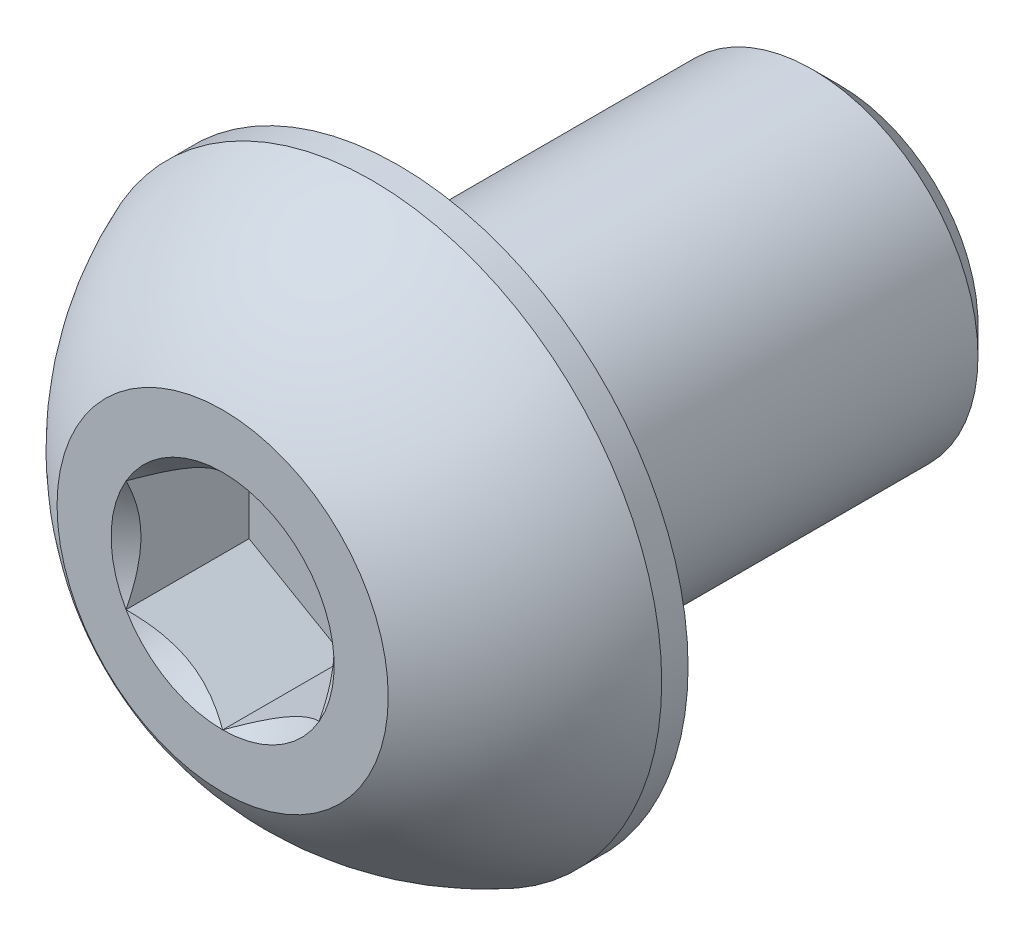
ISO-10303-21;
HEADER;
FILE_DESCRIPTION(('STEP AP214'),'2;1');
FILE_NAME('part.step','',(''),(''),'','','');
FILE_SCHEMA(('AUTOMOTIVE_DESIGN { 1 0 10303 214 1 1 1 1 }'));
ENDSEC;
DATA;
#1=APPLICATION_CONTEXT('core data for automotive mechanical design processes');
#2=APPLICATION_PROTOCOL_DEFINITION('international standard','automotive_design',2000,#1);
#3=PRODUCT_CONTEXT('',#1,'mechanical');
#4=PRODUCT('Part','Part','',(#3));
#5=PRODUCT_RELATED_PRODUCT_CATEGORY('part','',(#4));
#6=PRODUCT_DEFINITION_FORMATION('','',#4);
#7=PRODUCT_DEFINITION_CONTEXT('part definition',#1,'design');
#8=PRODUCT_DEFINITION('design','',#6,#7);
#9=PRODUCT_DEFINITION_SHAPE('','',#8);
#10=(LENGTH_UNIT() NAMED_UNIT(*) SI_UNIT(.MILLI.,.METRE.));
#11=(NAMED_UNIT(*) PLANE_ANGLE_UNIT() SI_UNIT($,.RADIAN.));
#12=(NAMED_UNIT(*) SI_UNIT($,.STERADIAN.) SOLID_ANGLE_UNIT());
#13=UNCERTAINTY_MEASURE_WITH_UNIT(LENGTH_MEASURE(1.E-05),#10,'distance_accuracy_value','');
#14=(GEOMETRIC_REPRESENTATION_CONTEXT(3) GLOBAL_UNCERTAINTY_ASSIGNED_CONTEXT((#13)) GLOBAL_UNIT_ASSIGNED_CONTEXT((#10,
#11,#12)) REPRESENTATION_CONTEXT('',''));
#15=CARTESIAN_POINT('',(0.,0.,0.));
#16=DIRECTION('',(0.,0.,1.));
#17=DIRECTION('',(1.,0.,0.));
#18=AXIS2_PLACEMENT_3D('',#15,#16,#17);
#19=CARTESIAN_POINT('',(0.,-4.76250000000001,-17.7546));
#20=DIRECTION('',(0.,0.,-1.));
#21=DIRECTION('',(0.,1.,0.));
#22=AXIS2_PLACEMENT_3D('',#19,#20,#21);
#23=PLANE('',#22);
#24=CARTESIAN_POINT('',(0.,0.,-17.7546));
#25=DIRECTION('',(0.,0.,-1.));
#26=DIRECTION('',(0.,1.,0.));
#27=AXIS2_PLACEMENT_3D('',#24,#25,#26);
#28=CIRCLE('',#27,3.96875);
#29=CARTESIAN_POINT('',(0.,3.96875,-17.7546));
#30=VERTEX_POINT('',#29);
#31=EDGE_CURVE('E174',#30,#30,#28,.T.);
#32=ORIENTED_EDGE('',*,*,#31,.T.);
#33=EDGE_LOOP('',(#32));
#34=FACE_BOUND('',#33,.T.);
#35=ADVANCED_FACE('F34',(#34),#23,.T.);
#36=CARTESIAN_POINT('',(0.,0.,-17.7546));
#37=DIRECTION('',(0.,0.,-1.));
#38=DIRECTION('',(0.,1.,0.));
#39=AXIS2_PLACEMENT_3D('',#36,#37,#38);
#40=CYLINDRICAL_SURFACE('',#39,4.76250000000001);
#41=CARTESIAN_POINT('',(0.,0.,-16.96085));
#42=DIRECTION('',(0.,0.,-1.));
#43=DIRECTION('',(0.,1.,0.));
#44=AXIS2_PLACEMENT_3D('',#41,#42,#43);
#45=CIRCLE('',#44,4.76250000000001);
#46=CARTESIAN_POINT('',(0.,4.76250000000001,-16.96085));
#47=VERTEX_POINT('',#46);
#48=EDGE_CURVE('E48',#47,#47,#45,.F.);
#49=ORIENTED_EDGE('',*,*,#48,.T.);
#50=EDGE_LOOP('',(#49));
#51=FACE_BOUND('',#50,.T.);
#52=CARTESIAN_POINT('',(0.,0.,-5.0546));
#53=DIRECTION('',(0.,0.,1.));
#54=DIRECTION('',(1.,0.,0.));
#55=AXIS2_PLACEMENT_3D('',#52,#53,#54);
#56=CIRCLE('',#55,4.76250000000001);
#57=CARTESIAN_POINT('',(4.76250000000001,0.,-5.0546));
#58=VERTEX_POINT('',#57);
#59=EDGE_CURVE('E171',#58,#58,#56,.F.);
#60=ORIENTED_EDGE('',*,*,#59,.T.);
#61=EDGE_LOOP('',(#60));
#62=FACE_BOUND('',#61,.T.);
#63=ADVANCED_FACE('F179',(#51,#62),#40,.T.);
#64=CARTESIAN_POINT('',(0.,0.,-17.7546));
#65=DIRECTION('',(0.,0.,1.));
#66=DIRECTION('',(0.,-1.,0.));
#67=AXIS2_PLACEMENT_3D('',#64,#65,#66);
#68=CONICAL_SURFACE('',#67,3.96875,0.785398163397445);
#69=ORIENTED_EDGE('',*,*,#48,.F.);
#70=EDGE_LOOP('',(#69));
#71=FACE_BOUND('',#70,.T.);
#72=ORIENTED_EDGE('',*,*,#31,.F.);
#73=EDGE_LOOP('',(#72));
#74=FACE_BOUND('',#73,.T.);
#75=ADVANCED_FACE('F36',(#71,#74),#68,.T.);
#76=CARTESIAN_POINT('',(0.,0.,-7.58617381466154));
#77=DIRECTION('',(0.,0.,1.));
#78=DIRECTION('',(0.,-1.,0.));
#79=AXIS2_PLACEMENT_3D('',#76,#77,#78);
#80=SPHERICAL_SURFACE('',#79,8.9572004217979);
#81=CARTESIAN_POINT('',(0.,0.,0.));
#82=DIRECTION('',(0.,0.,1.));
#83=DIRECTION('',(1.,0.,0.));
#84=AXIS2_PLACEMENT_3D('',#81,#82,#83);
#85=CIRCLE('',#84,4.7625);
#86=CARTESIAN_POINT('',(0.,-4.76250000000001,0.));
#87=VERTEX_POINT('',#86);
#88=EDGE_CURVE('E168',#87,#87,#85,.T.);
#89=CARTESIAN_POINT('',(0.,0.,-4.29641));
#90=DIRECTION('',(0.,0.,1.));
#91=DIRECTION('',(1.,0.,0.));
#92=AXIS2_PLACEMENT_3D('',#89,#90,#91);
#93=CIRCLE('',#92,8.3312);
#94=CARTESIAN_POINT('',(0.,-8.3312,-4.29641));
#95=VERTEX_POINT('',#94);
#96=EDGE_CURVE('E162',#95,#95,#93,.T.);
#97=CARTESIAN_POINT('',(0.,-4.76250000000001,0.));
#98=CARTESIAN_POINT('',(0.,-4.81260964553361,-0.0314580778612526));
#99=CARTESIAN_POINT('',(0.,-4.86240751258115,-0.0634127815227683));
#100=CARTESIAN_POINT('',(0.,-4.96136033481778,-0.128302589266069));
#101=CARTESIAN_POINT('',(0.,-5.01051529000687,-0.161237693347854));
#102=CARTESIAN_POINT('',(0.,-5.10816293364023,-0.228075450751433));
#103=CARTESIAN_POINT('',(0.,-5.15665562208451,-0.261978104073228));
#104=CARTESIAN_POINT('',(0.,-5.25295970503621,-0.330737625699055));
#105=CARTESIAN_POINT('',(0.,-5.30077109954363,-0.365594494003087));
#106=CARTESIAN_POINT('',(0.,-5.39569381682618,-0.436248764286398));
#107=CARTESIAN_POINT('',(0.,-5.44280513960132,-0.472046166265677));
#108=CARTESIAN_POINT('',(0.,-5.5363092153757,-0.544567445869758));
#109=CARTESIAN_POINT('',(0.,-5.58270196837494,-0.581291323494561));
#110=CARTESIAN_POINT('',(0.,-5.67475068741134,-0.655651134547838));
#111=CARTESIAN_POINT('',(0.,-5.72040665344851,-0.693287067976313));
#112=CARTESIAN_POINT('',(0.,-5.81096387103532,-0.769456212128974));
#113=CARTESIAN_POINT('',(0.,-5.85586512258497,-0.807989422853161));
#114=CARTESIAN_POINT('',(0.,-5.9448952799295,-0.885937990900428));
#115=CARTESIAN_POINT('',(0.,-5.98902418572438,-0.925353348223508));
#116=CARTESIAN_POINT('',(0.,-6.07649232359195,-1.00505073234355));
#117=CARTESIAN_POINT('',(0.,-6.11983155566464,-1.04533275914052));
#118=CARTESIAN_POINT('',(0.,-6.20570332819269,-1.1267476647809));
#119=CARTESIAN_POINT('',(0.,-6.24823586864804,-1.16788054362432));
#120=CARTESIAN_POINT('',(0.,-6.33247755680935,-1.25098100182577));
#121=CARTESIAN_POINT('',(0.,-6.37418670451531,-1.2929485811838));
#122=CARTESIAN_POINT('',(0.,-6.4567652293646,-1.37770196112388));
#123=CARTESIAN_POINT('',(0.,-6.49763460650794,-1.42048776170593));
#124=CARTESIAN_POINT('',(0.,-6.57851754216923,-1.50686078351464));
#125=CARTESIAN_POINT('',(0.,-6.61853110068718,-1.55044800474129));
#126=CARTESIAN_POINT('',(0.,-6.69768668708677,-1.63840675256828));
#127=CARTESIAN_POINT('',(0.,-6.73682871496841,-1.68277827916861));
#128=CARTESIAN_POINT('',(0.,-6.81422587030595,-1.77228821450101));
#129=CARTESIAN_POINT('',(0.,-6.85248099776185,-1.81742662323309));
#130=CARTESIAN_POINT('',(0.,-6.92808933071514,-1.90845259845763));
#131=CARTESIAN_POINT('',(0.,-6.96544253621253,-1.9543401649501));
#132=CARTESIAN_POINT('',(0.,-7.03923235787119,-2.04684643715441));
#133=CARTESIAN_POINT('',(0.,-7.07566897403246,-2.09346514286624));
#134=CARTESIAN_POINT('',(0.,-7.14761130955582,-2.1874153878739));
#135=CARTESIAN_POINT('',(0.,-7.18311702891791,-2.23474692716972));
#136=CARTESIAN_POINT('',(0.,-7.25318362891245,-2.3301042538036));
#137=CARTESIAN_POINT('',(0.,-7.2877445095449,-2.37813004114166));
#138=CARTESIAN_POINT('',(0.,-7.35590786115683,-2.47485700570988));
#139=CARTESIAN_POINT('',(0.,-7.38951033213631,-2.52355818294004));
#140=CARTESIAN_POINT('',(0.,-7.45574366985516,-2.6216168039388));
#141=CARTESIAN_POINT('',(0.,-7.48837453659454,-2.6709742477074));
#142=CARTESIAN_POINT('',(0.,-7.55265185276235,-2.77032602073538));
#143=CARTESIAN_POINT('',(0.,-7.58429830219079,-2.82032034999477));
#144=CARTESIAN_POINT('',(0.,-7.64659435721728,-2.92092626287137));
#145=CARTESIAN_POINT('',(0.,-7.67724396281533,-2.9715378464886));
#146=CARTESIAN_POINT('',(0.,-7.73753429507813,-3.07335839457714));
#147=CARTESIAN_POINT('',(0.,-7.7671750217429,-3.12456735904846));
#148=CARTESIAN_POINT('',(0.,-7.82543595723201,-3.22756256075197));
#149=CARTESIAN_POINT('',(0.,-7.85405616605636,-3.27934879798417));
#150=CARTESIAN_POINT('',(0.,-7.91026482752416,-3.3834782105059));
#151=CARTESIAN_POINT('',(0.,-7.93785328016762,-3.43582138579542));
#152=CARTESIAN_POINT('',(0.,-7.99198759665664,-3.54104412079172));
#153=CARTESIAN_POINT('',(0.,-8.0185334605022,-3.59392368049849));
#154=CARTESIAN_POINT('',(0.,-8.07057217397928,-3.70019842098381));
#155=CARTESIAN_POINT('',(0.,-8.0960650236108,-3.75359360176235));
#156=CARTESIAN_POINT('',(0.,-8.14598770489917,-3.86087861516291));
#157=CARTESIAN_POINT('',(0.,-8.17041753655603,-3.91476844778494));
#158=CARTESIAN_POINT('',(0.,-8.21820456505067,-4.02302161415683));
#159=CARTESIAN_POINT('',(0.,-8.24156176188847,-4.0773849479067));
#160=CARTESIAN_POINT('',(0.,-8.28719443890177,-4.18656373232087));
#161=CARTESIAN_POINT('',(0.,-8.30946991907727,-4.24137918298518));
#162=CARTESIAN_POINT('',(0.,-8.3312,-4.29641));
#163=B_SPLINE_CURVE_WITH_KNOTS('',3,(#97,#98,#99,#100,#101,#102,#103,#104,#105,#106,#107,#108,
#109,#110,#111,#112,#113,#114,#115,#116,#117,#118,#119,#120,#121,#122,#123,#124,#125,#126,#127,
#128,#129,#130,#131,#132,#133,#134,#135,#136,#137,#138,#139,#140,#141,#142,#143,#144,#145,#146,
#147,#148,#149,#150,#151,#152,#153,#154,#155,#156,#157,#158,#159,#160,#161,#162),.UNSPECIFIED.,
.F.,.F.,(4,2,2,2,2,2,2,2,2,2,2,2,2,2,2,2,2,2,2,2,2,2,2,2,2,2,2,2,2,2,2,2,4),(0.,
0.177494373175661,0.354988746351321,0.532483119526982,0.709977492702643,0.887471865878304,
1.06496623905396,1.24246061222962,1.41995498540528,1.59744935858095,1.77494373175661,
1.95243810493227,2.12993247810793,2.30742685128359,2.48492122445925,2.66241559763491,
2.83990997081057,3.01740434398623,3.19489871716189,3.37239309033755,3.54988746351321,
3.72738183668887,3.90487620986453,4.08237058304019,4.25986495621586,4.43735932939151,
4.61485370256717,4.79234807574283,4.9698424489185,5.14733682209416,5.32483119526982,
5.50232556844548,5.67981994162114),.UNSPECIFIED.);
#164=EDGE_CURVE('BSEAM184',#87,#95,#163,.T.);
#165=ORIENTED_EDGE('',*,*,#88,.F.);
#166=ORIENTED_EDGE('',*,*,#96,.T.);
#167=ORIENTED_EDGE('',*,*,#164,.T.);
#168=ORIENTED_EDGE('',*,*,#164,.F.);
#169=EDGE_LOOP('',(#165,#167,#166,#168));
#170=FACE_BOUND('',#169,.T.);
#171=ADVANCED_FACE('F184',(#170),#80,.T.);
#172=CARTESIAN_POINT('',(0.,-4.7625,0.));
#173=DIRECTION('',(0.,0.,-1.));
#174=DIRECTION('',(-1.,0.,0.));
#175=AXIS2_PLACEMENT_3D('',#172,#173,#174);
#176=PLANE('',#175);
#177=CARTESIAN_POINT('',(0.,0.,0.));
#178=DIRECTION('',(0.,0.,1.));
#179=DIRECTION('',(1.,0.,0.));
#180=AXIS2_PLACEMENT_3D('',#177,#178,#179);
#181=CIRCLE('',#180,3.20790243318486);
#182=CARTESIAN_POINT('',(-2.778125,1.60395121659243,0.));
#183=VERTEX_POINT('',#182);
#184=CARTESIAN_POINT('',(-2.778125,-1.60395121659243,0.));
#185=VERTEX_POINT('',#184);
#186=EDGE_CURVE('E61',#183,#185,#181,.T.);
#187=ORIENTED_EDGE('',*,*,#186,.F.);
#188=CARTESIAN_POINT('',(0.,3.20790243318486,0.));
#189=VERTEX_POINT('',#188);
#190=EDGE_CURVE('E133',#189,#183,#181,.T.);
#191=ORIENTED_EDGE('',*,*,#190,.F.);
#192=CARTESIAN_POINT('',(2.778125,1.60395121659243,0.));
#193=VERTEX_POINT('',#192);
#194=EDGE_CURVE('E130',#193,#189,#181,.T.);
#195=ORIENTED_EDGE('',*,*,#194,.F.);
#196=CARTESIAN_POINT('',(2.778125,-1.60395121659243,0.));
#197=VERTEX_POINT('',#196);
#198=EDGE_CURVE('E101',#197,#193,#181,.T.);
#199=ORIENTED_EDGE('',*,*,#198,.F.);
#200=CARTESIAN_POINT('',(0.,-3.20790243318486,0.));
#201=VERTEX_POINT('',#200);
#202=EDGE_CURVE('E93',#201,#197,#181,.T.);
#203=ORIENTED_EDGE('',*,*,#202,.F.);
#204=EDGE_CURVE('E54',#185,#201,#181,.T.);
#205=ORIENTED_EDGE('',*,*,#204,.F.);
#206=EDGE_LOOP('',(#187,#191,#195,#199,#203,#205));
#207=FACE_BOUND('',#206,.T.);
#208=ORIENTED_EDGE('',*,*,#88,.T.);
#209=EDGE_LOOP('',(#208));
#210=FACE_BOUND('',#209,.T.);
#211=ADVANCED_FACE('F127',(#207,#210),#176,.F.);
#212=CARTESIAN_POINT('',(0.,-8.3312,-5.0546));
#213=DIRECTION('',(0.,0.,1.));
#214=DIRECTION('',(1.,0.,0.));
#215=AXIS2_PLACEMENT_3D('',#212,#213,#214);
#216=PLANE('',#215);
#217=ORIENTED_EDGE('',*,*,#59,.F.);
#218=EDGE_LOOP('',(#217));
#219=FACE_BOUND('',#218,.T.);
#220=CARTESIAN_POINT('',(0.,0.,-5.0546));
#221=DIRECTION('',(0.,0.,1.));
#222=DIRECTION('',(1.,0.,0.));
#223=AXIS2_PLACEMENT_3D('',#220,#221,#222);
#224=CIRCLE('',#223,8.3312);
#225=CARTESIAN_POINT('',(8.3312,0.,-5.0546));
#226=VERTEX_POINT('',#225);
#227=EDGE_CURVE('E165',#226,#226,#224,.T.);
#228=ORIENTED_EDGE('',*,*,#227,.F.);
#229=EDGE_LOOP('',(#228));
#230=FACE_BOUND('',#229,.T.);
#231=ADVANCED_FACE('F198',(#219,#230),#216,.F.);
#232=CARTESIAN_POINT('',(0.,0.,0.));
#233=DIRECTION('',(0.,0.,1.));
#234=DIRECTION('',(1.,0.,0.));
#235=AXIS2_PLACEMENT_3D('',#232,#233,#234);
#236=CYLINDRICAL_SURFACE('',#235,8.3312);
#237=ORIENTED_EDGE('',*,*,#96,.F.);
#238=EDGE_LOOP('',(#237));
#239=FACE_BOUND('',#238,.T.);
#240=ORIENTED_EDGE('',*,*,#227,.T.);
#241=EDGE_LOOP('',(#240));
#242=FACE_BOUND('',#241,.T.);
#243=ADVANCED_FACE('F201',(#239,#242),#236,.T.);
#244=CARTESIAN_POINT('',(0.,0.,0.));
#245=DIRECTION('',(0.,0.,1.));
#246=DIRECTION('',(1.,0.,0.));
#247=AXIS2_PLACEMENT_3D('',#244,#245,#246);
#248=CONICAL_SURFACE('',#247,3.20790243318486,0.78539816339745);
#249=ORIENTED_EDGE('',*,*,#198,.T.);
#250=CARTESIAN_POINT('',(2.778125,-3.19893339067494,1.0289777106946));
#251=CARTESIAN_POINT('',(2.778125,-3.12104287934486,0.97018211283306));
#252=CARTESIAN_POINT('',(2.778125,-3.04271626337405,0.911954852440523));
#253=CARTESIAN_POINT('',(2.778125,-2.88501879277219,0.796891469853696));
#254=CARTESIAN_POINT('',(2.778125,-2.8056476809397,0.74005570054895));
#255=CARTESIAN_POINT('',(2.778125,-2.64510859117419,0.627625663638876));
#256=CARTESIAN_POINT('',(2.778125,-2.56393145572794,0.572044427731463));
#257=CARTESIAN_POINT('',(2.778125,-2.40019929215893,0.462956578017752));
#258=CARTESIAN_POINT('',(2.778125,-2.3176443619757,0.409449817639812));
#259=CARTESIAN_POINT('',(2.778125,-2.14616017979605,0.301978364366634));
#260=CARTESIAN_POINT('',(2.778125,-2.05713676020373,0.248163163943378));
#261=CARTESIAN_POINT('',(2.778125,-1.8770377409329,0.14408918647956));
#262=CARTESIAN_POINT('',(2.778125,-1.7859624140087,0.0938299403905547));
#263=CARTESIAN_POINT('',(2.778125,-1.60172984286437,-0.00207206480527287));
#264=CARTESIAN_POINT('',(2.778125,-1.5085793926458,-0.0477277732966193));
#265=CARTESIAN_POINT('',(2.778125,-1.31973803298637,-0.133392376231559));
#266=CARTESIAN_POINT('',(2.778125,-1.22404829730511,-0.173403827462187));
#267=CARTESIAN_POINT('',(2.778125,-1.03779113415405,-0.243419596624836));
#268=CARTESIAN_POINT('',(2.778125,-0.947431177162334,-0.273970108451923));
#269=CARTESIAN_POINT('',(2.778125,-0.764535760780937,-0.327821956565465));
#270=CARTESIAN_POINT('',(2.778125,-0.672000151991208,-0.351122793450317));
#271=CARTESIAN_POINT('',(2.778125,-0.48684505542671,-0.388870830510862));
#272=CARTESIAN_POINT('',(2.778125,-0.394257006574068,-0.403469723558987));
#273=CARTESIAN_POINT('',(2.778125,-0.208091161985989,-0.42353049645738));
#274=CARTESIAN_POINT('',(2.778125,-0.114513539170276,-0.428993946942665));
#275=CARTESIAN_POINT('',(2.778125,0.0693219370915156,-0.430378152359917));
#276=CARTESIAN_POINT('',(2.778125,0.159577353029252,-0.426637154425347));
#277=CARTESIAN_POINT('',(2.778125,0.339314453776425,-0.410565100498833));
#278=CARTESIAN_POINT('',(2.778125,0.428796062566547,-0.398233210023558));
#279=CARTESIAN_POINT('',(2.778125,0.607853741349495,-0.365443365234143));
#280=CARTESIAN_POINT('',(2.778125,0.697404117826913,-0.344847126319414));
#281=CARTESIAN_POINT('',(2.778125,0.874544782985401,-0.29662337114372));
#282=CARTESIAN_POINT('',(2.778125,0.96213523500764,-0.268996443216507));
#283=CARTESIAN_POINT('',(2.778125,1.23792450105837,-0.171622660041378));
#284=CARTESIAN_POINT('',(2.778125,1.42222250546988,-0.0907854186578157));
#285=CARTESIAN_POINT('',(2.778125,1.69191166926745,0.0439414309000999));
#286=CARTESIAN_POINT('',(2.778125,1.78085005463527,0.091201899849552));
#287=CARTESIAN_POINT('',(2.778125,1.95670554902788,0.189353137107523));
#288=CARTESIAN_POINT('',(2.778125,2.04362301855726,0.240243251244161));
#289=CARTESIAN_POINT('',(2.778125,2.2113951070011,0.342314648803834));
#290=CARTESIAN_POINT('',(2.778125,2.29233619472003,0.393355424408363));
#291=CARTESIAN_POINT('',(2.778125,2.45283061736786,0.497584684681206));
#292=CARTESIAN_POINT('',(2.778125,2.53238384652636,0.550773332026382));
#293=CARTESIAN_POINT('',(2.778125,2.68963703454146,0.658473672033093));
#294=CARTESIAN_POINT('',(2.778125,2.76734679840955,0.712971107779714));
#295=CARTESIAN_POINT('',(2.778125,2.92170433307698,0.823407173708459));
#296=CARTESIAN_POINT('',(2.778125,2.99835239004628,0.879345403442682));
#297=CARTESIAN_POINT('',(2.778125,3.07455608571853,0.935872855106462));
#298=B_SPLINE_CURVE_WITH_KNOTS('',3,(#250,#251,#252,#253,#254,#255,#256,#257,#258,#259,#260,
#261,#262,#263,#264,#265,#266,#267,#268,#269,#270,#271,#272,#273,#274,#275,#276,#277,#278,#279,
#280,#281,#282,#283,#284,#285,#286,#287,#288,#289,#290,#291,#292,#293,#294,#295,#296,#297),
.UNSPECIFIED.,.F.,.F.,(4,2,2,2,2,2,2,2,2,2,2,2,2,2,2,2,2,2,2,2,2,2,2,4),(0.,0.292776498067377,
0.585626492410667,0.880745572137449,1.1758437621447,1.4878538759786,1.79982275706806,
2.11088806424748,2.42181200660889,2.70771495231929,2.99363758840123,3.27441800895721,
3.55515015063457,3.82572098330844,4.09631810176541,4.37164557500333,4.64695001618686,
5.24881162882136,5.55093378415049,5.85300162485613,6.14003787153079,6.42709589886174,
6.71182211913082,6.9964700400641),.UNSPECIFIED.);
#299=EDGE_CURVE('E11',#197,#193,#298,.T.);
#300=ORIENTED_EDGE('',*,*,#299,.F.);
#301=EDGE_LOOP('',(#249,#300));
#302=FACE_BOUND('',#301,.T.);
#303=ADVANCED_FACE('F105',(#302),#248,.F.);
#304=ORIENTED_EDGE('',*,*,#194,.T.);
#305=CARTESIAN_POINT('',(2.778325,1.60383574653859,0.000115476288217845));
#306=CARTESIAN_POINT('',(2.68282743030512,1.65897129410888,-0.0549730585165407));
#307=CARTESIAN_POINT('',(2.58573301735401,1.71502877956301,-0.106826159617406));
#308=CARTESIAN_POINT('',(2.38774683834097,1.82933615331202,-0.201767944367233));
#309=CARTESIAN_POINT('',(2.28683624347529,1.88759691242181,-0.244803802888671));
#310=CARTESIAN_POINT('',(2.08335484845557,2.00507695061152,-0.318525062571837));
#311=CARTESIAN_POINT('',(1.98083586921719,2.06426631087185,-0.349395758548836));
#312=CARTESIAN_POINT('',(1.7735409933049,2.18394806328144,-0.396958461862229));
#313=CARTESIAN_POINT('',(1.66877142911016,2.24443679937215,-0.413685973168938));
#314=CARTESIAN_POINT('',(1.48820620685326,2.34868617904846,-0.428778529590966));
#315=CARTESIAN_POINT('',(1.41264381636973,2.39231214553473,-0.431012689750827));
#316=CARTESIAN_POINT('',(1.26164255832216,2.47949276251647,-0.427248593219663));
#317=CARTESIAN_POINT('',(1.1862037433429,2.52304738265209,-0.421247450458765));
#318=CARTESIAN_POINT('',(1.03603843948389,2.60974536125803,-0.401354250985611));
#319=CARTESIAN_POINT('',(0.961312842655921,2.65288820470202,-0.387453367409122));
#320=CARTESIAN_POINT('',(0.813153837918538,2.73842784597001,-0.35252373910669));
#321=CARTESIAN_POINT('',(0.739720331398932,2.78082470072664,-0.331495540829374));
#322=CARTESIAN_POINT('',(0.551630036055698,2.88941868337502,-0.2690702359893));
#323=CARTESIAN_POINT('',(0.43813937342228,2.95494254799693,-0.222968153666739));
#324=CARTESIAN_POINT('',(0.271261180751078,3.05128971745753,-0.145141753603579));
#325=CARTESIAN_POINT('',(0.216267345914601,3.08304042280414,-0.117797173342816));
#326=CARTESIAN_POINT('',(0.107298308842253,3.14595372569119,-0.0606153843428645));
#327=CARTESIAN_POINT('',(0.0533225059622775,3.17711667001367,-0.0307797055955576));
#328=CARTESIAN_POINT('',(-0.000200000000000565,3.2080179032387,0.000115476288217379));
#329=B_SPLINE_CURVE_WITH_KNOTS('',3,(#305,#306,#307,#308,#309,#310,#311,#312,#313,#314,#315,
#316,#317,#318,#319,#320,#321,#322,#323,#324,#325,#326,#327,#328),.UNSPECIFIED.,.F.,.F.,(4,2,2,
2,2,2,2,2,2,2,2,4),(0.,0.370053591379832,0.742263257937907,1.10856148626471,1.47393743409704,
1.7354084329343,1.99697108794063,2.25882657917954,2.52066199859285,2.93655069655312,
3.14393114948166,3.35118515668741),.UNSPECIFIED.);
#330=EDGE_CURVE('E132',#193,#189,#329,.T.);
#331=ORIENTED_EDGE('',*,*,#330,.F.);
#332=EDGE_LOOP('',(#304,#331));
#333=FACE_BOUND('',#332,.T.);
#334=ADVANCED_FACE('F286',(#333),#248,.F.);
#335=ORIENTED_EDGE('',*,*,#190,.T.);
#336=CARTESIAN_POINT('',(0.000199999999999544,3.2080179032387,0.000115476288216849));
#337=CARTESIAN_POINT('',(-0.095297569694879,3.1528823556684,-0.054973058516541));
#338=CARTESIAN_POINT('',(-0.192391982645986,3.09682487021427,-0.106826159617406));
#339=CARTESIAN_POINT('',(-0.390378161659028,2.98251749646527,-0.201767944367234));
#340=CARTESIAN_POINT('',(-0.491288756524714,2.92425673735548,-0.244803802888671));
#341=CARTESIAN_POINT('',(-0.69477015154443,2.80677669916576,-0.318525062571837));
#342=CARTESIAN_POINT('',(-0.797289130782812,2.74758733890544,-0.349395758548836));
#343=CARTESIAN_POINT('',(-1.0045840066951,2.62790558649585,-0.396958461862228));
#344=CARTESIAN_POINT('',(-1.10935357088984,2.56741685040514,-0.413685973168938));
#345=CARTESIAN_POINT('',(-1.28991879314674,2.46316747072883,-0.428778529590967));
#346=CARTESIAN_POINT('',(-1.36548118363027,2.41954150424255,-0.431012689750826));
#347=CARTESIAN_POINT('',(-1.51648244167784,2.33236088726081,-0.427248593219663));
#348=CARTESIAN_POINT('',(-1.59192125665709,2.2888062671252,-0.421247450458765));
#349=CARTESIAN_POINT('',(-1.7420865605161,2.20210828851926,-0.401354250985612));
#350=CARTESIAN_POINT('',(-1.81681215734408,2.15896544507527,-0.387453367409122));
#351=CARTESIAN_POINT('',(-1.96497116208146,2.07342580380727,-0.352523739106691));
#352=CARTESIAN_POINT('',(-2.03840466860107,2.03102894905064,-0.331495540829375));
#353=CARTESIAN_POINT('',(-2.2264949639443,1.92243496640227,-0.269070235989301));
#354=CARTESIAN_POINT('',(-2.33998562657772,1.85691110178036,-0.222968153666739));
#355=CARTESIAN_POINT('',(-2.50686381924892,1.76056393231976,-0.145141753603579));
#356=CARTESIAN_POINT('',(-2.5618576540854,1.72881322697315,-0.117797173342816));
#357=CARTESIAN_POINT('',(-2.67082669115775,1.6658999240861,-0.0606153843428647));
#358=CARTESIAN_POINT('',(-2.72480249403772,1.63473697976362,-0.0307797055955579));
#359=CARTESIAN_POINT('',(-2.778325,1.60383574653859,0.00011547628821733));
#360=B_SPLINE_CURVE_WITH_KNOTS('',3,(#336,#337,#338,#339,#340,#341,#342,#343,#344,#345,#346,
#347,#348,#349,#350,#351,#352,#353,#354,#355,#356,#357,#358,#359),.UNSPECIFIED.,.F.,.F.,(4,2,2,
2,2,2,2,2,2,2,2,4),(0.,0.370053591379831,0.742263257937906,1.10856148626471,1.47393743409704,
1.73540843293429,1.99697108794063,2.25882657917954,2.52066199859284,2.93655069655311,
3.14393114948166,3.35118515668741),.UNSPECIFIED.);
#361=EDGE_CURVE('E137',#189,#183,#360,.T.);
#362=ORIENTED_EDGE('',*,*,#361,.F.);
#363=EDGE_LOOP('',(#335,#362));
#364=FACE_BOUND('',#363,.T.);
#365=ADVANCED_FACE('F140',(#364),#248,.F.);
#366=ORIENTED_EDGE('',*,*,#186,.T.);
#367=CARTESIAN_POINT('',(-2.778125,-3.19893339020952,1.0289777103432));
#368=CARTESIAN_POINT('',(-2.778125,-3.12104287889249,0.970182112495188));
#369=CARTESIAN_POINT('',(-2.778125,-3.04271626293479,0.911954852116165));
#370=CARTESIAN_POINT('',(-2.778125,-2.88501879235925,0.796891469556289));
#371=CARTESIAN_POINT('',(-2.778125,-2.80564768054,0.740055700264979));
#372=CARTESIAN_POINT('',(-2.778125,-2.6451085908014,0.627625663381871));
#373=CARTESIAN_POINT('',(-2.778125,-2.56393145536883,0.572044427487983));
#374=CARTESIAN_POINT('',(-2.778125,-2.40019929182743,0.462956577801108));
#375=CARTESIAN_POINT('',(-2.778125,-2.31764436165813,0.409449817436479));
#376=CARTESIAN_POINT('',(-2.778125,-2.14616017950853,0.301978364190993));
#377=CARTESIAN_POINT('',(-2.778125,-2.05713675993236,0.248163163782066));
#378=CARTESIAN_POINT('',(-2.778125,-1.8770377406944,0.14408918634623));
#379=CARTESIAN_POINT('',(-2.778125,-1.78596241378693,0.0938299402708783));
#380=CARTESIAN_POINT('',(-2.778125,-1.60172984267664,-0.00207206489877312));
#381=CARTESIAN_POINT('',(-2.778125,-1.50857939247541,-0.0477277733775888));
#382=CARTESIAN_POINT('',(-2.778125,-1.31973803285156,-0.133392376289046));
#383=CARTESIAN_POINT('',(-2.778125,-1.22404829718855,-0.173403827508721));
#384=CARTESIAN_POINT('',(-2.778125,-1.03779113404538,-0.243419596663191));
#385=CARTESIAN_POINT('',(-2.778125,-0.947431177042492,-0.273970108490983));
#386=CARTESIAN_POINT('',(-2.778125,-0.764535760638396,-0.327821956603667));
#387=CARTESIAN_POINT('',(-2.778125,-0.672000151837137,-0.351122793486958));
#388=CARTESIAN_POINT('',(-2.778125,-0.486845055249957,-0.388870830541768));
#389=CARTESIAN_POINT('',(-2.778125,-0.39425700638617,-0.403469723585786));
#390=CARTESIAN_POINT('',(-2.778125,-0.208091161776172,-0.423530496473446));
#391=CARTESIAN_POINT('',(-2.778125,-0.114513538949687,-0.428993946952106));
#392=CARTESIAN_POINT('',(-2.778125,0.0693219373319799,-0.430378152354228));
#393=CARTESIAN_POINT('',(-2.778125,0.159577353278848,-0.42663715441128));
#394=CARTESIAN_POINT('',(-2.778125,0.339314454043369,-0.410565100466707));
#395=CARTESIAN_POINT('',(-2.778125,0.428796062841708,-0.398233209981751));
#396=CARTESIAN_POINT('',(-2.778125,0.607853741640879,-0.365443365172042));
#397=CARTESIAN_POINT('',(-2.778125,0.697404118126277,-0.344847126246641));
#398=CARTESIAN_POINT('',(-2.778125,0.874544783299955,-0.296623371049367));
#399=CARTESIAN_POINT('',(-2.778125,0.962135235329404,-0.268996443111246));
#400=CARTESIAN_POINT('',(-2.778125,1.2379245014502,-0.171622659884701));
#401=CARTESIAN_POINT('',(-2.778125,1.42222250592108,-0.0907854184538323));
#402=CARTESIAN_POINT('',(-2.778125,1.69191166980411,0.0439414311788917));
#403=CARTESIAN_POINT('',(-2.778125,1.78085005519992,0.0912019001540048));
#404=CARTESIAN_POINT('',(-2.778125,1.95670554964761,0.189353137464123));
#405=CARTESIAN_POINT('',(-2.778125,2.04362301920408,0.240243251627246));
#406=CARTESIAN_POINT('',(-2.778125,2.21139510769715,0.34231464923721));
#407=CARTESIAN_POINT('',(-2.778125,2.29233619543831,0.393355424865429));
#408=CARTESIAN_POINT('',(-2.778125,2.4528306181303,0.497584685185755));
#409=CARTESIAN_POINT('',(-2.778125,2.53238384731072,0.550773332554723));
#410=CARTESIAN_POINT('',(-2.778125,2.68963703536912,0.658473672608748));
#411=CARTESIAN_POINT('',(-2.778125,2.76734679925861,0.712971108378888));
#412=CARTESIAN_POINT('',(-2.778125,2.92170433396869,0.823407174354644));
#413=CARTESIAN_POINT('',(-2.778125,2.99835239095924,0.879345404112358));
#414=CARTESIAN_POINT('',(-2.778125,3.07455608665271,0.935872855799597));
#415=B_SPLINE_CURVE_WITH_KNOTS('',3,(#367,#368,#369,#370,#371,#372,#373,#374,#375,#376,#377,
#378,#379,#380,#381,#382,#383,#384,#385,#386,#387,#388,#389,#390,#391,#392,#393,#394,#395,#396,
#397,#398,#399,#400,#401,#402,#403,#404,#405,#406,#407,#408,#409,#410,#411,#412,#413,#414),
.UNSPECIFIED.,.F.,.F.,(4,2,2,2,2,2,2,2,2,2,2,2,2,2,2,2,2,2,2,2,2,2,2,4),(0.,0.292776498011651,
0.585626492299197,0.88074557196919,1.17584376191966,1.48785387568985,1.79982275671564,
2.11088806383187,2.42181200613021,2.70771495187289,2.99363758798706,3.27441800857396,
3.55515015028224,3.82572098298441,4.0963181014697,4.37164557473811,4.64695001595212,
5.2488116288057,5.55093378424513,5.85300162506103,6.14003787183002,6.42709589925532,
6.71182211961747,6.9964700406438),.UNSPECIFIED.);
#416=EDGE_CURVE('E144',#183,#185,#415,.F.);
#417=ORIENTED_EDGE('',*,*,#416,.F.);
#418=EDGE_LOOP('',(#366,#417));
#419=FACE_BOUND('',#418,.T.);
#420=ADVANCED_FACE('F280',(#419),#248,.F.);
#421=ORIENTED_EDGE('',*,*,#204,.T.);
#422=CARTESIAN_POINT('',(-2.778325,-1.60383574653859,0.000115476288217848));
#423=CARTESIAN_POINT('',(-2.68282743030512,-1.65897129410888,-0.0549730585165407));
#424=CARTESIAN_POINT('',(-2.58573301735401,-1.71502877956301,-0.106826159617406));
#425=CARTESIAN_POINT('',(-2.38774683834097,-1.82933615331202,-0.201767944367233));
#426=CARTESIAN_POINT('',(-2.28683624347529,-1.88759691242181,-0.24480380288867));
#427=CARTESIAN_POINT('',(-2.08335484845557,-2.00507695061152,-0.318525062571837));
#428=CARTESIAN_POINT('',(-1.98083586921719,-2.06426631087185,-0.349395758548836));
#429=CARTESIAN_POINT('',(-1.7735409933049,-2.18394806328144,-0.396958461862228));
#430=CARTESIAN_POINT('',(-1.66877142911016,-2.24443679937215,-0.413685973168938));
#431=CARTESIAN_POINT('',(-1.48820620685326,-2.34868617904846,-0.428778529590966));
#432=CARTESIAN_POINT('',(-1.41264381636973,-2.39231214553474,-0.431012689750826));
#433=CARTESIAN_POINT('',(-1.26164255832216,-2.47949276251647,-0.427248593219662));
#434=CARTESIAN_POINT('',(-1.1862037433429,-2.52304738265209,-0.421247450458765));
#435=CARTESIAN_POINT('',(-1.0360384394839,-2.60974536125803,-0.401354250985611));
#436=CARTESIAN_POINT('',(-0.961312842655922,-2.65288820470202,-0.387453367409121));
#437=CARTESIAN_POINT('',(-0.813153837918539,-2.73842784597001,-0.35252373910669));
#438=CARTESIAN_POINT('',(-0.739720331398933,-2.78082470072665,-0.331495540829373));
#439=CARTESIAN_POINT('',(-0.551630036055698,-2.88941868337502,-0.269070235989299));
#440=CARTESIAN_POINT('',(-0.43813937342228,-2.95494254799693,-0.222968153666738));
#441=CARTESIAN_POINT('',(-0.271261180751078,-3.05128971745753,-0.145141753603578));
#442=CARTESIAN_POINT('',(-0.2162673459146,-3.08304042280414,-0.117797173342815));
#443=CARTESIAN_POINT('',(-0.107298308842252,-3.14595372569119,-0.0606153843428637));
#444=CARTESIAN_POINT('',(-0.0533225059622768,-3.17711667001367,-0.030779705595557));
#445=CARTESIAN_POINT('',(0.000200000000001139,-3.2080179032387,0.000115476288217847));
#446=B_SPLINE_CURVE_WITH_KNOTS('',3,(#422,#423,#424,#425,#426,#427,#428,#429,#430,#431,#432,
#433,#434,#435,#436,#437,#438,#439,#440,#441,#442,#443,#444,#445),.UNSPECIFIED.,.F.,.F.,(4,2,2,
2,2,2,2,2,2,2,2,4),(0.,0.370053591379831,0.742263257937906,1.10856148626471,1.47393743409704,
1.73540843293429,1.99697108794063,2.25882657917954,2.52066199859284,2.93655069655312,
3.14393114948166,3.35118515668741),.UNSPECIFIED.);
#447=EDGE_CURVE('E117',#185,#201,#446,.T.);
#448=ORIENTED_EDGE('',*,*,#447,.F.);
#449=EDGE_LOOP('',(#421,#448));
#450=FACE_BOUND('',#449,.T.);
#451=ADVANCED_FACE('F228',(#450),#248,.F.);
#452=ORIENTED_EDGE('',*,*,#202,.T.);
#453=CARTESIAN_POINT('',(-0.00019999999999902,-3.2080179032387,0.000115476288217716));
#454=CARTESIAN_POINT('',(0.0952975696948795,-3.1528823556684,-0.0549730585165408));
#455=CARTESIAN_POINT('',(0.192391982645986,-3.09682487021427,-0.106826159617406));
#456=CARTESIAN_POINT('',(0.390378161659029,-2.98251749646527,-0.201767944367233));
#457=CARTESIAN_POINT('',(0.491288756524714,-2.92425673735548,-0.24480380288867));
#458=CARTESIAN_POINT('',(0.694770151544431,-2.80677669916576,-0.318525062571836));
#459=CARTESIAN_POINT('',(0.797289130782813,-2.74758733890544,-0.349395758548835));
#460=CARTESIAN_POINT('',(1.0045840066951,-2.62790558649585,-0.396958461862228));
#461=CARTESIAN_POINT('',(1.10935357088984,-2.56741685040514,-0.413685973168937));
#462=CARTESIAN_POINT('',(1.28991879314674,-2.46316747072883,-0.428778529590965));
#463=CARTESIAN_POINT('',(1.36548118363027,-2.41954150424255,-0.431012689750825));
#464=CARTESIAN_POINT('',(1.51648244167784,-2.33236088726082,-0.427248593219662));
#465=CARTESIAN_POINT('',(1.59192125665709,-2.2888062671252,-0.421247450458765));
#466=CARTESIAN_POINT('',(1.7420865605161,-2.20210828851926,-0.401354250985611));
#467=CARTESIAN_POINT('',(1.81681215734408,-2.15896544507527,-0.387453367409121));
#468=CARTESIAN_POINT('',(1.96497116208146,-2.07342580380728,-0.35252373910669));
#469=CARTESIAN_POINT('',(2.03840466860107,-2.03102894905064,-0.331495540829374));
#470=CARTESIAN_POINT('',(2.2264949639443,-1.92243496640227,-0.2690702359893));
#471=CARTESIAN_POINT('',(2.33998562657772,-1.85691110178036,-0.222968153666738));
#472=CARTESIAN_POINT('',(2.50686381924892,-1.76056393231976,-0.145141753603579));
#473=CARTESIAN_POINT('',(2.5618576540854,-1.72881322697315,-0.117797173342815));
#474=CARTESIAN_POINT('',(2.67082669115775,-1.6658999240861,-0.0606153843428641));
#475=CARTESIAN_POINT('',(2.72480249403772,-1.63473697976362,-0.0307797055955572));
#476=CARTESIAN_POINT('',(2.778325,-1.60383574653859,0.000115476288217986));
#477=B_SPLINE_CURVE_WITH_KNOTS('',3,(#453,#454,#455,#456,#457,#458,#459,#460,#461,#462,#463,
#464,#465,#466,#467,#468,#469,#470,#471,#472,#473,#474,#475,#476),.UNSPECIFIED.,.F.,.F.,(4,2,2,
2,2,2,2,2,2,2,2,4),(0.,0.370053591379831,0.742263257937906,1.10856148626471,1.47393743409704,
1.73540843293429,1.99697108794063,2.25882657917954,2.52066199859284,2.93655069655311,
3.14393114948166,3.35118515668741),.UNSPECIFIED.);
#478=EDGE_CURVE('E97',#201,#197,#477,.T.);
#479=ORIENTED_EDGE('',*,*,#478,.F.);
#480=EDGE_LOOP('',(#452,#479));
#481=FACE_BOUND('',#480,.T.);
#482=ADVANCED_FACE('F95',(#481),#248,.F.);
#483=CARTESIAN_POINT('',(2.778125,-1.60395121659243,-3.53822));
#484=DIRECTION('',(0.,0.,1.));
#485=DIRECTION('',(1.,0.,0.));
#486=AXIS2_PLACEMENT_3D('',#483,#484,#485);
#487=PLANE('',#486);
#488=DIRECTION('',(0.866025403784438,0.5,0.));
#489=VECTOR('',#488,1.);
#490=CARTESIAN_POINT('',(0.,-3.20790243318486,-3.53822));
#491=LINE('',#490,#489);
#492=CARTESIAN_POINT('',(0.,-3.20790243318486,-3.53822));
#493=VERTEX_POINT('',#492);
#494=CARTESIAN_POINT('',(2.778125,-1.60395121659243,-3.53822));
#495=VERTEX_POINT('',#494);
#496=EDGE_CURVE('E116',#493,#495,#491,.T.);
#497=ORIENTED_EDGE('',*,*,#496,.T.);
#498=DIRECTION('',(0.,1.,0.));
#499=VECTOR('',#498,1.);
#500=CARTESIAN_POINT('',(2.778125,-1.60395121659243,-3.53822));
#501=LINE('',#500,#499);
#502=CARTESIAN_POINT('',(2.778125,1.60395121659243,-3.53822));
#503=VERTEX_POINT('',#502);
#504=EDGE_CURVE('E121',#495,#503,#501,.T.);
#505=ORIENTED_EDGE('',*,*,#504,.T.);
#506=DIRECTION('',(-0.866025403784439,0.5,0.));
#507=VECTOR('',#506,1.);
#508=CARTESIAN_POINT('',(2.778125,1.60395121659243,-3.53822));
#509=LINE('',#508,#507);
#510=CARTESIAN_POINT('',(0.,3.20790243318486,-3.53822));
#511=VERTEX_POINT('',#510);
#512=EDGE_CURVE('E270',#503,#511,#509,.T.);
#513=ORIENTED_EDGE('',*,*,#512,.T.);
#514=DIRECTION('',(-0.866025403784438,-0.5,0.));
#515=VECTOR('',#514,1.);
#516=CARTESIAN_POINT('',(0.,3.20790243318486,-3.53822));
#517=LINE('',#516,#515);
#518=CARTESIAN_POINT('',(-2.778125,1.60395121659243,-3.53822));
#519=VERTEX_POINT('',#518);
#520=EDGE_CURVE('E153',#511,#519,#517,.T.);
#521=ORIENTED_EDGE('',*,*,#520,.T.);
#522=DIRECTION('',(0.,-1.,0.));
#523=VECTOR('',#522,1.);
#524=CARTESIAN_POINT('',(-2.778125,1.60395121659243,-3.53822));
#525=LINE('',#524,#523);
#526=CARTESIAN_POINT('',(-2.778125,-1.60395121659243,-3.53822));
#527=VERTEX_POINT('',#526);
#528=EDGE_CURVE('E274',#519,#527,#525,.T.);
#529=ORIENTED_EDGE('',*,*,#528,.T.);
#530=DIRECTION('',(0.866025403784439,-0.5,0.));
#531=VECTOR('',#530,1.);
#532=CARTESIAN_POINT('',(-2.778125,-1.60395121659243,-3.53822));
#533=LINE('',#532,#531);
#534=EDGE_CURVE('E124',#527,#493,#533,.T.);
#535=ORIENTED_EDGE('',*,*,#534,.T.);
#536=EDGE_LOOP('',(#497,#505,#513,#521,#529,#535));
#537=FACE_BOUND('',#536,.T.);
#538=ADVANCED_FACE('F227',(#537),#487,.T.);
#539=CARTESIAN_POINT('',(2.778125,-1.60395121659243,-3.53822));
#540=DIRECTION('',(1.,0.,0.));
#541=DIRECTION('',(0.,1.,0.));
#542=AXIS2_PLACEMENT_3D('',#539,#540,#541);
#543=PLANE('',#542);
#544=DIRECTION('',(0.,0.,1.));
#545=VECTOR('',#544,1.);
#546=CARTESIAN_POINT('',(2.778125,-1.60395121659243,-3.53822));
#547=LINE('',#546,#545);
#548=EDGE_CURVE('E113',#495,#197,#547,.T.);
#549=ORIENTED_EDGE('',*,*,#548,.T.);
#550=ORIENTED_EDGE('',*,*,#299,.T.);
#551=DIRECTION('',(0.,0.,1.));
#552=VECTOR('',#551,1.);
#553=CARTESIAN_POINT('',(2.778125,1.60395121659243,-3.53822));
#554=LINE('',#553,#552);
#555=EDGE_CURVE('E123',#503,#193,#554,.T.);
#556=ORIENTED_EDGE('',*,*,#555,.F.);
#557=ORIENTED_EDGE('',*,*,#504,.F.);
#558=EDGE_LOOP('',(#549,#550,#556,#557));
#559=FACE_BOUND('',#558,.T.);
#560=ADVANCED_FACE('F119',(#559),#543,.F.);
#561=CARTESIAN_POINT('',(2.778125,1.60395121659243,-3.53822));
#562=DIRECTION('',(0.5,0.866025403784439,0.));
#563=DIRECTION('',(-0.866025403784439,0.5,0.));
#564=AXIS2_PLACEMENT_3D('',#561,#562,#563);
#565=PLANE('',#564);
#566=ORIENTED_EDGE('',*,*,#555,.T.);
#567=ORIENTED_EDGE('',*,*,#330,.T.);
#568=DIRECTION('',(0.,0.,1.));
#569=VECTOR('',#568,1.);
#570=CARTESIAN_POINT('',(0.,3.20790243318486,-3.53822));
#571=LINE('',#570,#569);
#572=EDGE_CURVE('E149',#511,#189,#571,.T.);
#573=ORIENTED_EDGE('',*,*,#572,.F.);
#574=ORIENTED_EDGE('',*,*,#512,.F.);
#575=EDGE_LOOP('',(#566,#567,#573,#574));
#576=FACE_BOUND('',#575,.T.);
#577=ADVANCED_FACE('F147',(#576),#565,.F.);
#578=CARTESIAN_POINT('',(0.,3.20790243318486,-3.53822));
#579=DIRECTION('',(-0.5,0.866025403784438,0.));
#580=DIRECTION('',(-0.866025403784439,-0.5,0.));
#581=AXIS2_PLACEMENT_3D('',#578,#579,#580);
#582=PLANE('',#581);
#583=ORIENTED_EDGE('',*,*,#572,.T.);
#584=ORIENTED_EDGE('',*,*,#361,.T.);
#585=DIRECTION('',(0.,0.,1.));
#586=VECTOR('',#585,1.);
#587=CARTESIAN_POINT('',(-2.778125,1.60395121659243,-3.53822));
#588=LINE('',#587,#586);
#589=EDGE_CURVE('E155',#519,#183,#588,.T.);
#590=ORIENTED_EDGE('',*,*,#589,.F.);
#591=ORIENTED_EDGE('',*,*,#520,.F.);
#592=EDGE_LOOP('',(#583,#584,#590,#591));
#593=FACE_BOUND('',#592,.T.);
#594=ADVANCED_FACE('F151',(#593),#582,.F.);
#595=CARTESIAN_POINT('',(-2.778125,1.60395121659243,-3.53822));
#596=DIRECTION('',(-1.,0.,0.));
#597=DIRECTION('',(0.,0.,1.));
#598=AXIS2_PLACEMENT_3D('',#595,#596,#597);
#599=PLANE('',#598);
#600=ORIENTED_EDGE('',*,*,#589,.T.);
#601=ORIENTED_EDGE('',*,*,#416,.T.);
#602=DIRECTION('',(0.,0.,1.));
#603=VECTOR('',#602,1.);
#604=CARTESIAN_POINT('',(-2.778125,-1.60395121659243,-3.53822));
#605=LINE('',#604,#603);
#606=EDGE_CURVE('E157',#527,#185,#605,.T.);
#607=ORIENTED_EDGE('',*,*,#606,.F.);
#608=ORIENTED_EDGE('',*,*,#528,.F.);
#609=EDGE_LOOP('',(#600,#601,#607,#608));
#610=FACE_BOUND('',#609,.T.);
#611=ADVANCED_FACE('F249',(#610),#599,.F.);
#612=CARTESIAN_POINT('',(-2.778125,-1.60395121659243,-3.53822));
#613=DIRECTION('',(-0.5,-0.866025403784439,0.));
#614=DIRECTION('',(0.866025403784439,-0.5,0.));
#615=AXIS2_PLACEMENT_3D('',#612,#613,#614);
#616=PLANE('',#615);
#617=ORIENTED_EDGE('',*,*,#606,.T.);
#618=ORIENTED_EDGE('',*,*,#447,.T.);
#619=DIRECTION('',(0.,0.,1.));
#620=VECTOR('',#619,1.);
#621=CARTESIAN_POINT('',(0.,-3.20790243318486,-3.53822));
#622=LINE('',#621,#620);
#623=EDGE_CURVE('E115',#493,#201,#622,.T.);
#624=ORIENTED_EDGE('',*,*,#623,.F.);
#625=ORIENTED_EDGE('',*,*,#534,.F.);
#626=EDGE_LOOP('',(#617,#618,#624,#625));
#627=FACE_BOUND('',#626,.T.);
#628=ADVANCED_FACE('F208',(#627),#616,.F.);
#629=CARTESIAN_POINT('',(0.,-3.20790243318486,-3.53822));
#630=DIRECTION('',(0.5,-0.866025403784438,0.));
#631=DIRECTION('',(0.866025403784439,0.5,0.));
#632=AXIS2_PLACEMENT_3D('',#629,#630,#631);
#633=PLANE('',#632);
#634=ORIENTED_EDGE('',*,*,#623,.T.);
#635=ORIENTED_EDGE('',*,*,#478,.T.);
#636=ORIENTED_EDGE('',*,*,#548,.F.);
#637=ORIENTED_EDGE('',*,*,#496,.F.);
#638=EDGE_LOOP('',(#634,#635,#636,#637));
#639=FACE_BOUND('',#638,.T.);
#640=ADVANCED_FACE('F111',(#639),#633,.F.);
#641=CLOSED_SHELL('',(#35,#63,#75,#171,#211,#231,#243,#303,#334,#365,#420,#451,#482,#538,#560,
#577,#594,#611,#628,#640));
#642=MANIFOLD_SOLID_BREP('B2',#641);
#643=ADVANCED_BREP_SHAPE_REPRESENTATION('',(#18,#642),#14);
#644=SHAPE_DEFINITION_REPRESENTATION(#9,#643);
ENDSEC;
END-ISO-10303-21;
